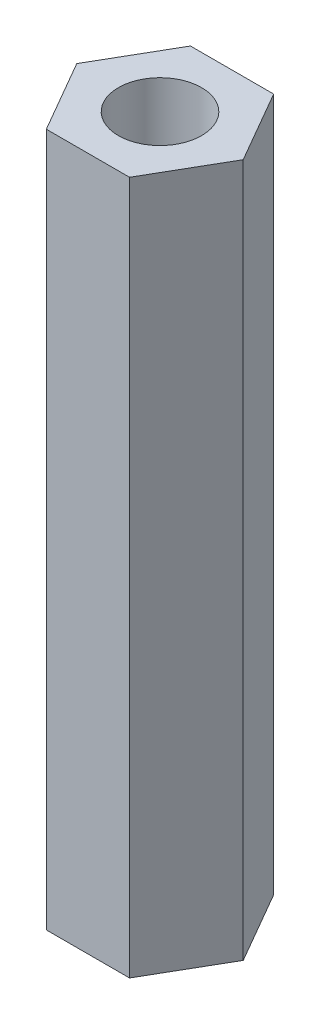
ISO-10303-21;
HEADER;
FILE_DESCRIPTION(('STEP AP214'),'2;1');
FILE_NAME('part.step','',(''),(''),'','','');
FILE_SCHEMA(('AUTOMOTIVE_DESIGN { 1 0 10303 214 1 1 1 1 }'));
ENDSEC;
DATA;
#1=APPLICATION_CONTEXT('core data for automotive mechanical design processes');
#2=APPLICATION_PROTOCOL_DEFINITION('international standard','automotive_design',2000,#1);
#3=PRODUCT_CONTEXT('',#1,'mechanical');
#4=PRODUCT('Part','Part','',(#3));
#5=PRODUCT_RELATED_PRODUCT_CATEGORY('part','',(#4));
#6=PRODUCT_DEFINITION_FORMATION('','',#4);
#7=PRODUCT_DEFINITION_CONTEXT('part definition',#1,'design');
#8=PRODUCT_DEFINITION('design','',#6,#7);
#9=PRODUCT_DEFINITION_SHAPE('','',#8);
#10=(LENGTH_UNIT() NAMED_UNIT(*) SI_UNIT(.MILLI.,.METRE.));
#11=(NAMED_UNIT(*) PLANE_ANGLE_UNIT() SI_UNIT($,.RADIAN.));
#12=(NAMED_UNIT(*) SI_UNIT($,.STERADIAN.) SOLID_ANGLE_UNIT());
#13=UNCERTAINTY_MEASURE_WITH_UNIT(LENGTH_MEASURE(1.E-05),#10,'distance_accuracy_value','');
#14=(GEOMETRIC_REPRESENTATION_CONTEXT(3) GLOBAL_UNCERTAINTY_ASSIGNED_CONTEXT((#13)) GLOBAL_UNIT_ASSIGNED_CONTEXT((#10,
#11,#12)) REPRESENTATION_CONTEXT('',''));
#15=CARTESIAN_POINT('',(0.,0.,0.));
#16=DIRECTION('',(0.,0.,1.));
#17=DIRECTION('',(1.,0.,0.));
#18=AXIS2_PLACEMENT_3D('',#15,#16,#17);
#19=CARTESIAN_POINT('',(0.,25.,0.));
#20=DIRECTION('',(0.,1.,0.));
#21=DIRECTION('',(0.,0.,1.));
#22=AXIS2_PLACEMENT_3D('',#19,#20,#21);
#23=PLANE('',#22);
#24=DIRECTION('',(-1.,0.,0.));
#25=VECTOR('',#24,1.);
#26=CARTESIAN_POINT('',(1.5,25.,-2.59807621135332));
#27=LINE('',#26,#25);
#28=CARTESIAN_POINT('',(1.5,25.,-2.59807621135332));
#29=VERTEX_POINT('',#28);
#30=CARTESIAN_POINT('',(-1.5,25.,-2.59807621135332));
#31=VERTEX_POINT('',#30);
#32=EDGE_CURVE('E129',#29,#31,#27,.T.);
#33=ORIENTED_EDGE('',*,*,#32,.T.);
#34=DIRECTION('',(-0.5,0.,0.866025403784439));
#35=VECTOR('',#34,1.);
#36=CARTESIAN_POINT('',(-1.5,25.,-2.59807621135332));
#37=LINE('',#36,#35);
#38=CARTESIAN_POINT('',(-3.,25.,0.));
#39=VERTEX_POINT('',#38);
#40=EDGE_CURVE('E87',#31,#39,#37,.T.);
#41=ORIENTED_EDGE('',*,*,#40,.T.);
#42=DIRECTION('',(0.5,0.,0.866025403784439));
#43=VECTOR('',#42,1.);
#44=CARTESIAN_POINT('',(-3.,25.,0.));
#45=LINE('',#44,#43);
#46=CARTESIAN_POINT('',(-1.5,25.,2.59807621135332));
#47=VERTEX_POINT('',#46);
#48=EDGE_CURVE('E100',#39,#47,#45,.T.);
#49=ORIENTED_EDGE('',*,*,#48,.T.);
#50=DIRECTION('',(1.,0.,0.));
#51=VECTOR('',#50,1.);
#52=CARTESIAN_POINT('',(-1.5,25.,2.59807621135332));
#53=LINE('',#52,#51);
#54=CARTESIAN_POINT('',(1.5,25.,2.59807621135332));
#55=VERTEX_POINT('',#54);
#56=EDGE_CURVE('E94',#47,#55,#53,.T.);
#57=ORIENTED_EDGE('',*,*,#56,.T.);
#58=DIRECTION('',(0.5,0.,-0.866025403784438));
#59=VECTOR('',#58,1.);
#60=CARTESIAN_POINT('',(1.5,25.,2.59807621135332));
#61=LINE('',#60,#59);
#62=CARTESIAN_POINT('',(3.,25.,0.));
#63=VERTEX_POINT('',#62);
#64=EDGE_CURVE('E98',#55,#63,#61,.T.);
#65=ORIENTED_EDGE('',*,*,#64,.T.);
#66=DIRECTION('',(-0.5,0.,-0.866025403784439));
#67=VECTOR('',#66,1.);
#68=CARTESIAN_POINT('',(3.,25.,0.));
#69=LINE('',#68,#67);
#70=EDGE_CURVE('E50',#63,#29,#69,.T.);
#71=ORIENTED_EDGE('',*,*,#70,.T.);
#72=EDGE_LOOP('',(#33,#41,#49,#57,#65,#71));
#73=FACE_BOUND('',#72,.T.);
#74=CARTESIAN_POINT('',(0.,25.,0.));
#75=DIRECTION('',(0.,1.,0.));
#76=DIRECTION('',(0.,0.,1.));
#77=AXIS2_PLACEMENT_3D('',#74,#75,#76);
#78=CIRCLE('',#77,1.5);
#79=CARTESIAN_POINT('',(0.,25.,1.5));
#80=VERTEX_POINT('',#79);
#81=EDGE_CURVE('E122',#80,#80,#78,.T.);
#82=ORIENTED_EDGE('',*,*,#81,.F.);
#83=EDGE_LOOP('',(#82));
#84=FACE_BOUND('',#83,.T.);
#85=ADVANCED_FACE('F33',(#73,#84),#23,.T.);
#86=CARTESIAN_POINT('',(0.,0.,0.));
#87=DIRECTION('',(0.,1.,0.));
#88=DIRECTION('',(0.,0.,1.));
#89=AXIS2_PLACEMENT_3D('',#86,#87,#88);
#90=PLANE('',#89);
#91=DIRECTION('',(-1.,0.,0.));
#92=VECTOR('',#91,1.);
#93=CARTESIAN_POINT('',(1.5,0.,-2.59807621135332));
#94=LINE('',#93,#92);
#95=CARTESIAN_POINT('',(1.5,0.,-2.59807621135332));
#96=VERTEX_POINT('',#95);
#97=CARTESIAN_POINT('',(-1.5,0.,-2.59807621135332));
#98=VERTEX_POINT('',#97);
#99=EDGE_CURVE('E118',#96,#98,#94,.T.);
#100=ORIENTED_EDGE('',*,*,#99,.F.);
#101=DIRECTION('',(-0.5,0.,-0.866025403784439));
#102=VECTOR('',#101,1.);
#103=CARTESIAN_POINT('',(3.,0.,0.));
#104=LINE('',#103,#102);
#105=CARTESIAN_POINT('',(3.,0.,0.));
#106=VERTEX_POINT('',#105);
#107=EDGE_CURVE('E79',#106,#96,#104,.T.);
#108=ORIENTED_EDGE('',*,*,#107,.F.);
#109=DIRECTION('',(0.5,0.,-0.866025403784438));
#110=VECTOR('',#109,1.);
#111=CARTESIAN_POINT('',(1.5,0.,2.59807621135332));
#112=LINE('',#111,#110);
#113=CARTESIAN_POINT('',(1.5,0.,2.59807621135332));
#114=VERTEX_POINT('',#113);
#115=EDGE_CURVE('E73',#114,#106,#112,.T.);
#116=ORIENTED_EDGE('',*,*,#115,.F.);
#117=DIRECTION('',(1.,0.,0.));
#118=VECTOR('',#117,1.);
#119=CARTESIAN_POINT('',(-1.5,0.,2.59807621135332));
#120=LINE('',#119,#118);
#121=CARTESIAN_POINT('',(-1.5,0.,2.59807621135332));
#122=VERTEX_POINT('',#121);
#123=EDGE_CURVE('E108',#122,#114,#120,.T.);
#124=ORIENTED_EDGE('',*,*,#123,.F.);
#125=DIRECTION('',(0.5,0.,0.866025403784439));
#126=VECTOR('',#125,1.);
#127=CARTESIAN_POINT('',(-3.,0.,0.));
#128=LINE('',#127,#126);
#129=CARTESIAN_POINT('',(-3.,0.,0.));
#130=VERTEX_POINT('',#129);
#131=EDGE_CURVE('E124',#130,#122,#128,.T.);
#132=ORIENTED_EDGE('',*,*,#131,.F.);
#133=DIRECTION('',(-0.5,0.,0.866025403784439));
#134=VECTOR('',#133,1.);
#135=CARTESIAN_POINT('',(-1.5,0.,-2.59807621135332));
#136=LINE('',#135,#134);
#137=EDGE_CURVE('E121',#98,#130,#136,.T.);
#138=ORIENTED_EDGE('',*,*,#137,.F.);
#139=EDGE_LOOP('',(#100,#108,#116,#124,#132,#138));
#140=FACE_BOUND('',#139,.T.);
#141=CARTESIAN_POINT('',(0.,0.,0.));
#142=DIRECTION('',(0.,1.,0.));
#143=DIRECTION('',(0.,0.,1.));
#144=AXIS2_PLACEMENT_3D('',#141,#142,#143);
#145=CIRCLE('',#144,1.5);
#146=CARTESIAN_POINT('',(0.,0.,1.5));
#147=VERTEX_POINT('',#146);
#148=EDGE_CURVE('E222',#147,#147,#145,.T.);
#149=ORIENTED_EDGE('',*,*,#148,.T.);
#150=EDGE_LOOP('',(#149));
#151=FACE_BOUND('',#150,.T.);
#152=ADVANCED_FACE('F138',(#140,#151),#90,.F.);
#153=CARTESIAN_POINT('',(1.5,25.,-2.59807621135332));
#154=DIRECTION('',(0.,0.,1.));
#155=DIRECTION('',(1.,0.,0.));
#156=AXIS2_PLACEMENT_3D('',#153,#154,#155);
#157=PLANE('',#156);
#158=ORIENTED_EDGE('',*,*,#99,.T.);
#159=DIRECTION('',(0.,-1.,0.));
#160=VECTOR('',#159,1.);
#161=CARTESIAN_POINT('',(-1.5,25.,-2.59807621135332));
#162=LINE('',#161,#160);
#163=EDGE_CURVE('E11',#31,#98,#162,.T.);
#164=ORIENTED_EDGE('',*,*,#163,.F.);
#165=ORIENTED_EDGE('',*,*,#32,.F.);
#166=DIRECTION('',(0.,-1.,0.));
#167=VECTOR('',#166,1.);
#168=CARTESIAN_POINT('',(1.5,25.,-2.59807621135332));
#169=LINE('',#168,#167);
#170=EDGE_CURVE('E114',#29,#96,#169,.T.);
#171=ORIENTED_EDGE('',*,*,#170,.T.);
#172=EDGE_LOOP('',(#158,#164,#165,#171));
#173=FACE_BOUND('',#172,.T.);
#174=ADVANCED_FACE('F35',(#173),#157,.F.);
#175=CARTESIAN_POINT('',(-1.5,25.,-2.59807621135332));
#176=DIRECTION('',(0.866025403784439,0.,0.5));
#177=DIRECTION('',(0.5,0.,-0.866025403784439));
#178=AXIS2_PLACEMENT_3D('',#175,#176,#177);
#179=PLANE('',#178);
#180=ORIENTED_EDGE('',*,*,#137,.T.);
#181=DIRECTION('',(0.,-1.,0.));
#182=VECTOR('',#181,1.);
#183=CARTESIAN_POINT('',(-3.,25.,0.));
#184=LINE('',#183,#182);
#185=EDGE_CURVE('E42',#39,#130,#184,.T.);
#186=ORIENTED_EDGE('',*,*,#185,.F.);
#187=ORIENTED_EDGE('',*,*,#40,.F.);
#188=ORIENTED_EDGE('',*,*,#163,.T.);
#189=EDGE_LOOP('',(#180,#186,#187,#188));
#190=FACE_BOUND('',#189,.T.);
#191=ADVANCED_FACE('F163',(#190),#179,.F.);
#192=CARTESIAN_POINT('',(-3.,25.,0.));
#193=DIRECTION('',(0.866025403784439,0.,-0.5));
#194=DIRECTION('',(-0.5,0.,-0.866025403784439));
#195=AXIS2_PLACEMENT_3D('',#192,#193,#194);
#196=PLANE('',#195);
#197=ORIENTED_EDGE('',*,*,#131,.T.);
#198=DIRECTION('',(0.,-1.,0.));
#199=VECTOR('',#198,1.);
#200=CARTESIAN_POINT('',(-1.5,25.,2.59807621135332));
#201=LINE('',#200,#199);
#202=EDGE_CURVE('E109',#47,#122,#201,.T.);
#203=ORIENTED_EDGE('',*,*,#202,.F.);
#204=ORIENTED_EDGE('',*,*,#48,.F.);
#205=ORIENTED_EDGE('',*,*,#185,.T.);
#206=EDGE_LOOP('',(#197,#203,#204,#205));
#207=FACE_BOUND('',#206,.T.);
#208=ADVANCED_FACE('F135',(#207),#196,.F.);
#209=CARTESIAN_POINT('',(-1.5,25.,2.59807621135332));
#210=DIRECTION('',(0.,0.,-1.));
#211=DIRECTION('',(-1.,0.,0.));
#212=AXIS2_PLACEMENT_3D('',#209,#210,#211);
#213=PLANE('',#212);
#214=ORIENTED_EDGE('',*,*,#123,.T.);
#215=DIRECTION('',(0.,-1.,0.));
#216=VECTOR('',#215,1.);
#217=CARTESIAN_POINT('',(1.5,25.,2.59807621135332));
#218=LINE('',#217,#216);
#219=EDGE_CURVE('E105',#55,#114,#218,.T.);
#220=ORIENTED_EDGE('',*,*,#219,.F.);
#221=ORIENTED_EDGE('',*,*,#56,.F.);
#222=ORIENTED_EDGE('',*,*,#202,.T.);
#223=EDGE_LOOP('',(#214,#220,#221,#222));
#224=FACE_BOUND('',#223,.T.);
#225=ADVANCED_FACE('F106',(#224),#213,.F.);
#226=CARTESIAN_POINT('',(1.5,25.,2.59807621135332));
#227=DIRECTION('',(-0.866025403784438,0.,-0.5));
#228=DIRECTION('',(-0.5,0.,0.866025403784439));
#229=AXIS2_PLACEMENT_3D('',#226,#227,#228);
#230=PLANE('',#229);
#231=ORIENTED_EDGE('',*,*,#115,.T.);
#232=DIRECTION('',(0.,-1.,0.));
#233=VECTOR('',#232,1.);
#234=CARTESIAN_POINT('',(3.,25.,0.));
#235=LINE('',#234,#233);
#236=EDGE_CURVE('E110',#63,#106,#235,.T.);
#237=ORIENTED_EDGE('',*,*,#236,.F.);
#238=ORIENTED_EDGE('',*,*,#64,.F.);
#239=ORIENTED_EDGE('',*,*,#219,.T.);
#240=EDGE_LOOP('',(#231,#237,#238,#239));
#241=FACE_BOUND('',#240,.T.);
#242=ADVANCED_FACE('F112',(#241),#230,.F.);
#243=CARTESIAN_POINT('',(3.,25.,0.));
#244=DIRECTION('',(-0.866025403784439,0.,0.5));
#245=DIRECTION('',(0.5,0.,0.866025403784439));
#246=AXIS2_PLACEMENT_3D('',#243,#244,#245);
#247=PLANE('',#246);
#248=ORIENTED_EDGE('',*,*,#107,.T.);
#249=ORIENTED_EDGE('',*,*,#170,.F.);
#250=ORIENTED_EDGE('',*,*,#70,.F.);
#251=ORIENTED_EDGE('',*,*,#236,.T.);
#252=EDGE_LOOP('',(#248,#249,#250,#251));
#253=FACE_BOUND('',#252,.T.);
#254=ADVANCED_FACE('F143',(#253),#247,.F.);
#255=CARTESIAN_POINT('',(0.,25.,0.));
#256=DIRECTION('',(0.,-1.,0.));
#257=DIRECTION('',(0.,0.,-1.));
#258=AXIS2_PLACEMENT_3D('',#255,#256,#257);
#259=CYLINDRICAL_SURFACE('',#258,1.5);
#260=ORIENTED_EDGE('',*,*,#81,.T.);
#261=EDGE_LOOP('',(#260));
#262=FACE_BOUND('',#261,.T.);
#263=ORIENTED_EDGE('',*,*,#148,.F.);
#264=EDGE_LOOP('',(#263));
#265=FACE_BOUND('',#264,.T.);
#266=ADVANCED_FACE('F145',(#262,#265),#259,.F.);
#267=CLOSED_SHELL('',(#85,#152,#174,#191,#208,#225,#242,#254,#266));
#268=MANIFOLD_SOLID_BREP('B2',#267);
#269=ADVANCED_BREP_SHAPE_REPRESENTATION('',(#18,#268),#14);
#270=SHAPE_DEFINITION_REPRESENTATION(#9,#269);
ENDSEC;
END-ISO-10303-21;
